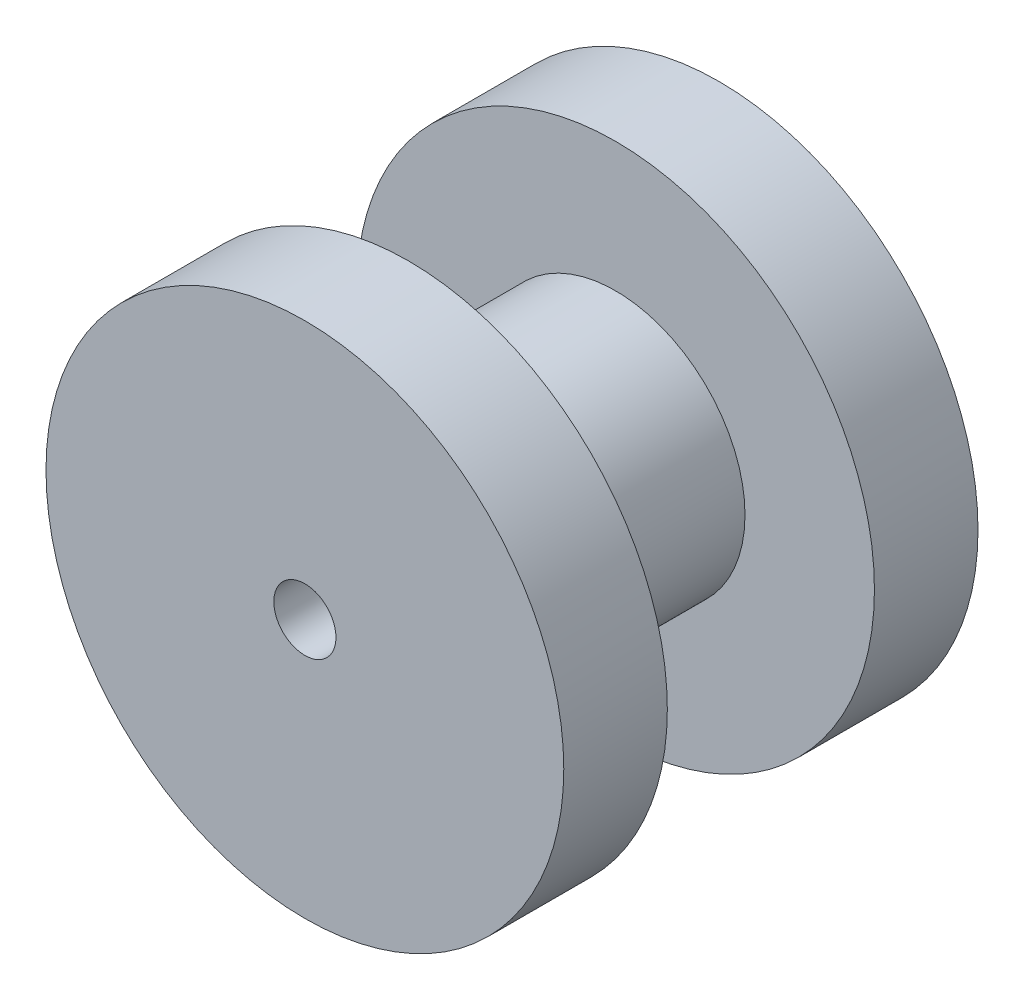
ISO-10303-21;
HEADER;
FILE_DESCRIPTION(('STEP AP214'),'2;1');
FILE_NAME('part.step','',(''),(''),'','','');
FILE_SCHEMA(('AUTOMOTIVE_DESIGN { 1 0 10303 214 1 1 1 1 }'));
ENDSEC;
DATA;
#1=APPLICATION_CONTEXT('core data for automotive mechanical design processes');
#2=APPLICATION_PROTOCOL_DEFINITION('international standard','automotive_design',2000,#1);
#3=PRODUCT_CONTEXT('',#1,'mechanical');
#4=PRODUCT('Part','Part','',(#3));
#5=PRODUCT_RELATED_PRODUCT_CATEGORY('part','',(#4));
#6=PRODUCT_DEFINITION_FORMATION('','',#4);
#7=PRODUCT_DEFINITION_CONTEXT('part definition',#1,'design');
#8=PRODUCT_DEFINITION('design','',#6,#7);
#9=PRODUCT_DEFINITION_SHAPE('','',#8);
#10=(LENGTH_UNIT() NAMED_UNIT(*) SI_UNIT(.MILLI.,.METRE.));
#11=(NAMED_UNIT(*) PLANE_ANGLE_UNIT() SI_UNIT($,.RADIAN.));
#12=(NAMED_UNIT(*) SI_UNIT($,.STERADIAN.) SOLID_ANGLE_UNIT());
#13=UNCERTAINTY_MEASURE_WITH_UNIT(LENGTH_MEASURE(1.E-05),#10,'distance_accuracy_value','');
#14=(GEOMETRIC_REPRESENTATION_CONTEXT(3) GLOBAL_UNCERTAINTY_ASSIGNED_CONTEXT((#13)) GLOBAL_UNIT_ASSIGNED_CONTEXT((#10,
#11,#12)) REPRESENTATION_CONTEXT('',''));
#15=CARTESIAN_POINT('',(0.,0.,0.));
#16=DIRECTION('',(0.,0.,1.));
#17=DIRECTION('',(1.,0.,0.));
#18=AXIS2_PLACEMENT_3D('',#15,#16,#17);
#19=CARTESIAN_POINT('',(0.,0.,20.));
#20=DIRECTION('',(0.,0.,-1.));
#21=DIRECTION('',(-1.,0.,0.));
#22=AXIS2_PLACEMENT_3D('',#19,#20,#21);
#23=CYLINDRICAL_SURFACE('',#22,50.);
#24=CARTESIAN_POINT('',(0.,0.,20.));
#25=DIRECTION('',(0.,0.,1.));
#26=DIRECTION('',(1.,0.,0.));
#27=AXIS2_PLACEMENT_3D('',#24,#25,#26);
#28=CIRCLE('',#27,50.);
#29=CARTESIAN_POINT('',(50.,0.,20.));
#30=VERTEX_POINT('',#29);
#31=EDGE_CURVE('E38',#30,#30,#28,.T.);
#32=ORIENTED_EDGE('',*,*,#31,.F.);
#33=EDGE_LOOP('',(#32));
#34=FACE_BOUND('',#33,.T.);
#35=CARTESIAN_POINT('',(0.,0.,0.));
#36=DIRECTION('',(0.,0.,1.));
#37=DIRECTION('',(1.,0.,0.));
#38=AXIS2_PLACEMENT_3D('',#35,#36,#37);
#39=CIRCLE('',#38,50.);
#40=CARTESIAN_POINT('',(50.,0.,0.));
#41=VERTEX_POINT('',#40);
#42=EDGE_CURVE('E34',#41,#41,#39,.T.);
#43=ORIENTED_EDGE('',*,*,#42,.T.);
#44=EDGE_LOOP('',(#43));
#45=FACE_BOUND('',#44,.T.);
#46=ADVANCED_FACE('F31',(#34,#45),#23,.T.);
#47=CARTESIAN_POINT('',(0.,0.,20.));
#48=DIRECTION('',(0.,0.,1.));
#49=DIRECTION('',(1.,0.,0.));
#50=AXIS2_PLACEMENT_3D('',#47,#48,#49);
#51=PLANE('',#50);
#52=CARTESIAN_POINT('',(0.,0.,20.));
#53=DIRECTION('',(0.,0.,1.));
#54=DIRECTION('',(1.,0.,0.));
#55=AXIS2_PLACEMENT_3D('',#52,#53,#54);
#56=CIRCLE('',#55,6.);
#57=CARTESIAN_POINT('',(6.,0.,20.));
#58=VERTEX_POINT('',#57);
#59=EDGE_CURVE('E54',#58,#58,#56,.T.);
#60=ORIENTED_EDGE('',*,*,#59,.F.);
#61=EDGE_LOOP('',(#60));
#62=FACE_BOUND('',#61,.T.);
#63=ORIENTED_EDGE('',*,*,#31,.T.);
#64=EDGE_LOOP('',(#63));
#65=FACE_BOUND('',#64,.T.);
#66=ADVANCED_FACE('F70',(#62,#65),#51,.T.);
#67=CARTESIAN_POINT('',(0.,0.,0.));
#68=DIRECTION('',(0.,0.,1.));
#69=DIRECTION('',(1.,0.,0.));
#70=AXIS2_PLACEMENT_3D('',#67,#68,#69);
#71=PLANE('',#70);
#72=CARTESIAN_POINT('',(0.,0.,0.));
#73=DIRECTION('',(0.,0.,-1.));
#74=DIRECTION('',(-1.,0.,0.));
#75=AXIS2_PLACEMENT_3D('',#72,#73,#74);
#76=CIRCLE('',#75,25.);
#77=CARTESIAN_POINT('',(-25.,0.,0.));
#78=VERTEX_POINT('',#77);
#79=EDGE_CURVE('E10',#78,#78,#76,.T.);
#80=ORIENTED_EDGE('',*,*,#79,.F.);
#81=EDGE_LOOP('',(#80));
#82=FACE_BOUND('',#81,.T.);
#83=ORIENTED_EDGE('',*,*,#42,.F.);
#84=EDGE_LOOP('',(#83));
#85=FACE_BOUND('',#84,.T.);
#86=ADVANCED_FACE('F73',(#82,#85),#71,.F.);
#87=CARTESIAN_POINT('',(0.,0.,-40.));
#88=DIRECTION('',(0.,0.,1.));
#89=DIRECTION('',(1.,0.,0.));
#90=AXIS2_PLACEMENT_3D('',#87,#88,#89);
#91=CYLINDRICAL_SURFACE('',#90,25.);
#92=CARTESIAN_POINT('',(0.,0.,-40.));
#93=DIRECTION('',(0.,0.,-1.));
#94=DIRECTION('',(-1.,0.,0.));
#95=AXIS2_PLACEMENT_3D('',#92,#93,#94);
#96=CIRCLE('',#95,25.);
#97=CARTESIAN_POINT('',(-25.,0.,-40.));
#98=VERTEX_POINT('',#97);
#99=EDGE_CURVE('E44',#98,#98,#96,.T.);
#100=ORIENTED_EDGE('',*,*,#99,.F.);
#101=EDGE_LOOP('',(#100));
#102=FACE_BOUND('',#101,.T.);
#103=ORIENTED_EDGE('',*,*,#79,.T.);
#104=EDGE_LOOP('',(#103));
#105=FACE_BOUND('',#104,.T.);
#106=ADVANCED_FACE('F83',(#102,#105),#91,.T.);
#107=CARTESIAN_POINT('',(0.,0.,-60.));
#108=DIRECTION('',(0.,0.,1.));
#109=DIRECTION('',(1.,0.,0.));
#110=AXIS2_PLACEMENT_3D('',#107,#108,#109);
#111=CYLINDRICAL_SURFACE('',#110,50.);
#112=CARTESIAN_POINT('',(0.,0.,-60.));
#113=DIRECTION('',(0.,0.,-1.));
#114=DIRECTION('',(-1.,0.,0.));
#115=AXIS2_PLACEMENT_3D('',#112,#113,#114);
#116=CIRCLE('',#115,50.);
#117=CARTESIAN_POINT('',(-50.,0.,-60.));
#118=VERTEX_POINT('',#117);
#119=EDGE_CURVE('E47',#118,#118,#116,.T.);
#120=ORIENTED_EDGE('',*,*,#119,.F.);
#121=EDGE_LOOP('',(#120));
#122=FACE_BOUND('',#121,.T.);
#123=CARTESIAN_POINT('',(0.,0.,-40.));
#124=DIRECTION('',(0.,0.,-1.));
#125=DIRECTION('',(-1.,0.,0.));
#126=AXIS2_PLACEMENT_3D('',#123,#124,#125);
#127=CIRCLE('',#126,50.);
#128=CARTESIAN_POINT('',(-50.,0.,-40.));
#129=VERTEX_POINT('',#128);
#130=EDGE_CURVE('E48',#129,#129,#127,.T.);
#131=ORIENTED_EDGE('',*,*,#130,.T.);
#132=EDGE_LOOP('',(#131));
#133=FACE_BOUND('',#132,.T.);
#134=ADVANCED_FACE('F88',(#122,#133),#111,.T.);
#135=CARTESIAN_POINT('',(0.,0.,-60.));
#136=DIRECTION('',(0.,0.,-1.));
#137=DIRECTION('',(-1.,0.,0.));
#138=AXIS2_PLACEMENT_3D('',#135,#136,#137);
#139=PLANE('',#138);
#140=CARTESIAN_POINT('',(0.,0.,-60.));
#141=DIRECTION('',(0.,0.,1.));
#142=DIRECTION('',(1.,0.,0.));
#143=AXIS2_PLACEMENT_3D('',#140,#141,#142);
#144=CIRCLE('',#143,6.);
#145=CARTESIAN_POINT('',(6.,0.,-60.));
#146=VERTEX_POINT('',#145);
#147=EDGE_CURVE('E51',#146,#146,#144,.T.);
#148=ORIENTED_EDGE('',*,*,#147,.T.);
#149=EDGE_LOOP('',(#148));
#150=FACE_BOUND('',#149,.T.);
#151=ORIENTED_EDGE('',*,*,#119,.T.);
#152=EDGE_LOOP('',(#151));
#153=FACE_BOUND('',#152,.T.);
#154=ADVANCED_FACE('F60',(#150,#153),#139,.T.);
#155=CARTESIAN_POINT('',(0.,0.,-40.));
#156=DIRECTION('',(0.,0.,-1.));
#157=DIRECTION('',(-1.,0.,0.));
#158=AXIS2_PLACEMENT_3D('',#155,#156,#157);
#159=PLANE('',#158);
#160=ORIENTED_EDGE('',*,*,#99,.T.);
#161=EDGE_LOOP('',(#160));
#162=FACE_BOUND('',#161,.T.);
#163=ORIENTED_EDGE('',*,*,#130,.F.);
#164=EDGE_LOOP('',(#163));
#165=FACE_BOUND('',#164,.T.);
#166=ADVANCED_FACE('F66',(#162,#165),#159,.F.);
#167=CARTESIAN_POINT('',(0.,0.,-60.));
#168=DIRECTION('',(0.,0.,1.));
#169=DIRECTION('',(1.,0.,0.));
#170=AXIS2_PLACEMENT_3D('',#167,#168,#169);
#171=CYLINDRICAL_SURFACE('',#170,6.);
#172=ORIENTED_EDGE('',*,*,#147,.F.);
#173=EDGE_LOOP('',(#172));
#174=FACE_BOUND('',#173,.T.);
#175=ORIENTED_EDGE('',*,*,#59,.T.);
#176=EDGE_LOOP('',(#175));
#177=FACE_BOUND('',#176,.T.);
#178=ADVANCED_FACE('F63',(#174,#177),#171,.F.);
#179=CLOSED_SHELL('',(#46,#66,#86,#106,#134,#154,#166,#178));
#180=MANIFOLD_SOLID_BREP('B2',#179);
#181=ADVANCED_BREP_SHAPE_REPRESENTATION('',(#18,#180),#14);
#182=SHAPE_DEFINITION_REPRESENTATION(#9,#181);
ENDSEC;
END-ISO-10303-21;
